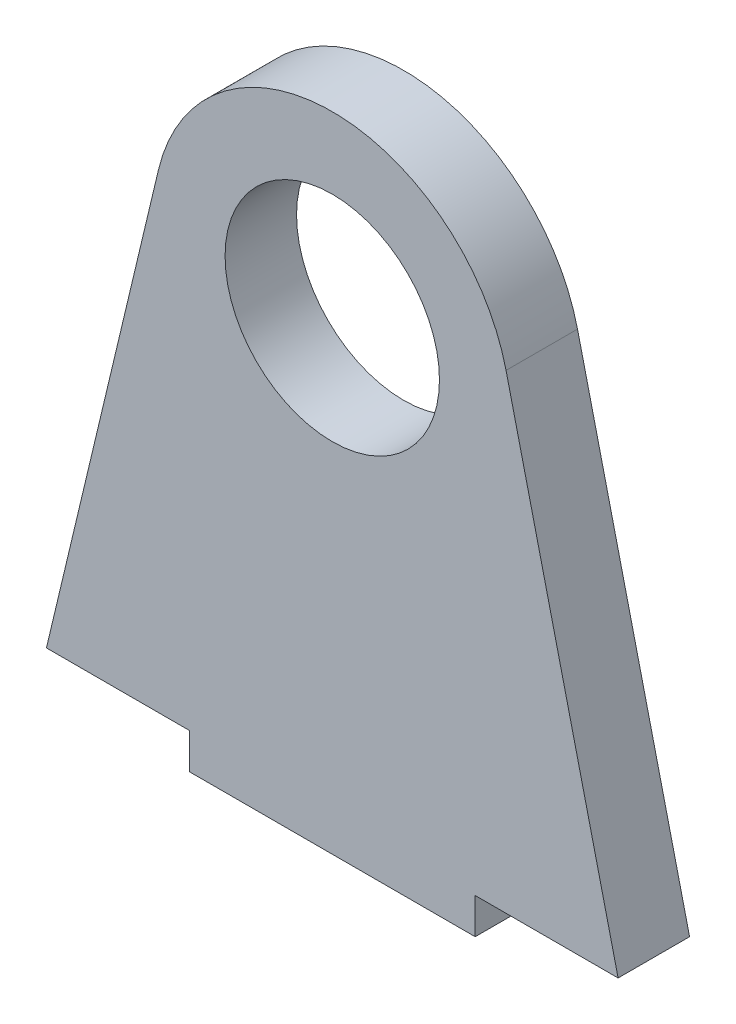
ISO-10303-21;
HEADER;
FILE_DESCRIPTION(('STEP AP214'),'2;1');
FILE_NAME('part.step','',(''),(''),'','','');
FILE_SCHEMA(('AUTOMOTIVE_DESIGN { 1 0 10303 214 1 1 1 1 }'));
ENDSEC;
DATA;
#1=APPLICATION_CONTEXT('core data for automotive mechanical design processes');
#2=APPLICATION_PROTOCOL_DEFINITION('international standard','automotive_design',2000,#1);
#3=PRODUCT_CONTEXT('',#1,'mechanical');
#4=PRODUCT('Part','Part','',(#3));
#5=PRODUCT_RELATED_PRODUCT_CATEGORY('part','',(#4));
#6=PRODUCT_DEFINITION_FORMATION('','',#4);
#7=PRODUCT_DEFINITION_CONTEXT('part definition',#1,'design');
#8=PRODUCT_DEFINITION('design','',#6,#7);
#9=PRODUCT_DEFINITION_SHAPE('','',#8);
#10=(LENGTH_UNIT() NAMED_UNIT(*) SI_UNIT(.MILLI.,.METRE.));
#11=(NAMED_UNIT(*) PLANE_ANGLE_UNIT() SI_UNIT($,.RADIAN.));
#12=(NAMED_UNIT(*) SI_UNIT($,.STERADIAN.) SOLID_ANGLE_UNIT());
#13=UNCERTAINTY_MEASURE_WITH_UNIT(LENGTH_MEASURE(1.E-05),#10,'distance_accuracy_value','');
#14=(GEOMETRIC_REPRESENTATION_CONTEXT(3) GLOBAL_UNCERTAINTY_ASSIGNED_CONTEXT((#13)) GLOBAL_UNIT_ASSIGNED_CONTEXT((#10,
#11,#12)) REPRESENTATION_CONTEXT('',''));
#15=CARTESIAN_POINT('',(0.,0.,0.));
#16=DIRECTION('',(0.,0.,1.));
#17=DIRECTION('',(1.,0.,0.));
#18=AXIS2_PLACEMENT_3D('',#15,#16,#17);
#19=CARTESIAN_POINT('',(0.,16.25,5.));
#20=DIRECTION('',(0.,0.,-1.));
#21=DIRECTION('',(-1.,0.,0.));
#22=AXIS2_PLACEMENT_3D('',#19,#20,#21);
#23=PLANE('',#22);
#24=DIRECTION('',(0.,-1.,0.));
#25=VECTOR('',#24,1.);
#26=CARTESIAN_POINT('',(-10.,-13.75,5.));
#27=LINE('',#26,#25);
#28=CARTESIAN_POINT('',(-10.,-13.75,5.));
#29=VERTEX_POINT('',#28);
#30=CARTESIAN_POINT('',(-10.,-16.25,5.));
#31=VERTEX_POINT('',#30);
#32=EDGE_CURVE('E166',#29,#31,#27,.T.);
#33=ORIENTED_EDGE('',*,*,#32,.T.);
#34=DIRECTION('',(1.,0.,0.));
#35=VECTOR('',#34,1.);
#36=CARTESIAN_POINT('',(10.,-16.25,5.));
#37=LINE('',#36,#35);
#38=CARTESIAN_POINT('',(10.,-16.25,5.));
#39=VERTEX_POINT('',#38);
#40=EDGE_CURVE('E102',#31,#39,#37,.T.);
#41=ORIENTED_EDGE('',*,*,#40,.T.);
#42=DIRECTION('',(0.,1.,0.));
#43=VECTOR('',#42,1.);
#44=CARTESIAN_POINT('',(10.,-13.75,5.));
#45=LINE('',#44,#43);
#46=CARTESIAN_POINT('',(10.,-13.75,5.));
#47=VERTEX_POINT('',#46);
#48=EDGE_CURVE('E187',#39,#47,#45,.T.);
#49=ORIENTED_EDGE('',*,*,#48,.T.);
#50=DIRECTION('',(1.,0.,0.));
#51=VECTOR('',#50,1.);
#52=CARTESIAN_POINT('',(20.,-13.75,5.));
#53=LINE('',#52,#51);
#54=CARTESIAN_POINT('',(20.,-13.75,5.));
#55=VERTEX_POINT('',#54);
#56=EDGE_CURVE('E201',#47,#55,#53,.T.);
#57=ORIENTED_EDGE('',*,*,#56,.T.);
#58=DIRECTION('',(-0.231836509941103,0.972754764911655,0.));
#59=VECTOR('',#58,1.);
#60=CARTESIAN_POINT('',(12.1594345613957,19.1479563742638,5.));
#61=LINE('',#60,#59);
#62=CARTESIAN_POINT('',(12.1594345613957,19.1479563742638,5.));
#63=VERTEX_POINT('',#62);
#64=EDGE_CURVE('E121',#55,#63,#61,.T.);
#65=ORIENTED_EDGE('',*,*,#64,.T.);
#66=CARTESIAN_POINT('',(0.,16.25,5.));
#67=DIRECTION('',(0.,0.,1.));
#68=DIRECTION('',(-1.,0.,0.));
#69=AXIS2_PLACEMENT_3D('',#66,#67,#68);
#70=CIRCLE('',#69,12.5);
#71=CARTESIAN_POINT('',(-12.1594345613957,19.1479563742638,5.));
#72=VERTEX_POINT('',#71);
#73=EDGE_CURVE('E115',#63,#72,#70,.T.);
#74=ORIENTED_EDGE('',*,*,#73,.T.);
#75=DIRECTION('',(-0.231836509941103,-0.972754764911655,0.));
#76=VECTOR('',#75,1.);
#77=CARTESIAN_POINT('',(-12.1594345613957,19.1479563742638,5.));
#78=LINE('',#77,#76);
#79=CARTESIAN_POINT('',(-20.,-13.75,5.));
#80=VERTEX_POINT('',#79);
#81=EDGE_CURVE('E119',#72,#80,#78,.T.);
#82=ORIENTED_EDGE('',*,*,#81,.T.);
#83=DIRECTION('',(1.,0.,0.));
#84=VECTOR('',#83,1.);
#85=CARTESIAN_POINT('',(-20.,-13.75,5.));
#86=LINE('',#85,#84);
#87=EDGE_CURVE('E59',#80,#29,#86,.T.);
#88=ORIENTED_EDGE('',*,*,#87,.T.);
#89=EDGE_LOOP('',(#33,#41,#49,#57,#65,#74,#82,#88));
#90=FACE_BOUND('',#89,.T.);
#91=CARTESIAN_POINT('',(0.,16.25,5.));
#92=DIRECTION('',(0.,0.,1.));
#93=DIRECTION('',(1.,0.,0.));
#94=AXIS2_PLACEMENT_3D('',#91,#92,#93);
#95=CIRCLE('',#94,7.5);
#96=CARTESIAN_POINT('',(7.5,16.25,5.));
#97=VERTEX_POINT('',#96);
#98=EDGE_CURVE('E148',#97,#97,#95,.T.);
#99=ORIENTED_EDGE('',*,*,#98,.F.);
#100=EDGE_LOOP('',(#99));
#101=FACE_BOUND('',#100,.T.);
#102=ADVANCED_FACE('F41',(#90,#101),#23,.F.);
#103=CARTESIAN_POINT('',(0.,16.25,0.));
#104=DIRECTION('',(0.,0.,-1.));
#105=DIRECTION('',(-1.,0.,0.));
#106=AXIS2_PLACEMENT_3D('',#103,#104,#105);
#107=PLANE('',#106);
#108=DIRECTION('',(0.,-1.,0.));
#109=VECTOR('',#108,1.);
#110=CARTESIAN_POINT('',(-10.,-13.75,0.));
#111=LINE('',#110,#109);
#112=CARTESIAN_POINT('',(-10.,-13.75,0.));
#113=VERTEX_POINT('',#112);
#114=CARTESIAN_POINT('',(-10.,-16.25,0.));
#115=VERTEX_POINT('',#114);
#116=EDGE_CURVE('E143',#113,#115,#111,.T.);
#117=ORIENTED_EDGE('',*,*,#116,.F.);
#118=DIRECTION('',(1.,0.,0.));
#119=VECTOR('',#118,1.);
#120=CARTESIAN_POINT('',(-20.,-13.75,0.));
#121=LINE('',#120,#119);
#122=CARTESIAN_POINT('',(-20.,-13.75,0.));
#123=VERTEX_POINT('',#122);
#124=EDGE_CURVE('E94',#123,#113,#121,.T.);
#125=ORIENTED_EDGE('',*,*,#124,.F.);
#126=DIRECTION('',(-0.231836509941103,-0.972754764911655,0.));
#127=VECTOR('',#126,1.);
#128=CARTESIAN_POINT('',(-12.1594345613957,19.1479563742638,0.));
#129=LINE('',#128,#127);
#130=CARTESIAN_POINT('',(-12.1594345613957,19.1479563742638,0.));
#131=VERTEX_POINT('',#130);
#132=EDGE_CURVE('E88',#131,#123,#129,.T.);
#133=ORIENTED_EDGE('',*,*,#132,.F.);
#134=CARTESIAN_POINT('',(0.,16.25,0.));
#135=DIRECTION('',(0.,0.,1.));
#136=DIRECTION('',(-1.,0.,0.));
#137=AXIS2_PLACEMENT_3D('',#134,#135,#136);
#138=CIRCLE('',#137,12.5);
#139=CARTESIAN_POINT('',(12.1594345613957,19.1479563742638,0.));
#140=VERTEX_POINT('',#139);
#141=EDGE_CURVE('E130',#140,#131,#138,.T.);
#142=ORIENTED_EDGE('',*,*,#141,.F.);
#143=DIRECTION('',(-0.231836509941103,0.972754764911655,0.));
#144=VECTOR('',#143,1.);
#145=CARTESIAN_POINT('',(12.1594345613957,19.1479563742638,0.));
#146=LINE('',#145,#144);
#147=CARTESIAN_POINT('',(20.,-13.75,0.));
#148=VERTEX_POINT('',#147);
#149=EDGE_CURVE('E157',#148,#140,#146,.T.);
#150=ORIENTED_EDGE('',*,*,#149,.F.);
#151=DIRECTION('',(1.,0.,0.));
#152=VECTOR('',#151,1.);
#153=CARTESIAN_POINT('',(20.,-13.75,0.));
#154=LINE('',#153,#152);
#155=CARTESIAN_POINT('',(10.,-13.75,0.));
#156=VERTEX_POINT('',#155);
#157=EDGE_CURVE('E154',#156,#148,#154,.T.);
#158=ORIENTED_EDGE('',*,*,#157,.F.);
#159=DIRECTION('',(0.,1.,0.));
#160=VECTOR('',#159,1.);
#161=CARTESIAN_POINT('',(10.,-13.75,0.));
#162=LINE('',#161,#160);
#163=CARTESIAN_POINT('',(10.,-16.25,0.));
#164=VERTEX_POINT('',#163);
#165=EDGE_CURVE('E151',#164,#156,#162,.T.);
#166=ORIENTED_EDGE('',*,*,#165,.F.);
#167=DIRECTION('',(1.,0.,0.));
#168=VECTOR('',#167,1.);
#169=CARTESIAN_POINT('',(10.,-16.25,0.));
#170=LINE('',#169,#168);
#171=EDGE_CURVE('E147',#115,#164,#170,.T.);
#172=ORIENTED_EDGE('',*,*,#171,.F.);
#173=EDGE_LOOP('',(#117,#125,#133,#142,#150,#158,#166,#172));
#174=FACE_BOUND('',#173,.T.);
#175=CARTESIAN_POINT('',(0.,16.25,0.));
#176=DIRECTION('',(0.,0.,1.));
#177=DIRECTION('',(1.,0.,0.));
#178=AXIS2_PLACEMENT_3D('',#175,#176,#177);
#179=CIRCLE('',#178,7.5);
#180=CARTESIAN_POINT('',(7.5,16.25,0.));
#181=VERTEX_POINT('',#180);
#182=EDGE_CURVE('E211',#181,#181,#179,.T.);
#183=ORIENTED_EDGE('',*,*,#182,.T.);
#184=EDGE_LOOP('',(#183));
#185=FACE_BOUND('',#184,.T.);
#186=ADVANCED_FACE('F191',(#174,#185),#107,.T.);
#187=CARTESIAN_POINT('',(-10.,-13.75,5.));
#188=DIRECTION('',(1.,0.,0.));
#189=DIRECTION('',(0.,1.,0.));
#190=AXIS2_PLACEMENT_3D('',#187,#188,#189);
#191=PLANE('',#190);
#192=ORIENTED_EDGE('',*,*,#116,.T.);
#193=DIRECTION('',(0.,0.,-1.));
#194=VECTOR('',#193,1.);
#195=CARTESIAN_POINT('',(-10.,-16.25,5.));
#196=LINE('',#195,#194);
#197=EDGE_CURVE('E11',#31,#115,#196,.T.);
#198=ORIENTED_EDGE('',*,*,#197,.F.);
#199=ORIENTED_EDGE('',*,*,#32,.F.);
#200=DIRECTION('',(0.,0.,-1.));
#201=VECTOR('',#200,1.);
#202=CARTESIAN_POINT('',(-10.,-13.75,5.));
#203=LINE('',#202,#201);
#204=EDGE_CURVE('E139',#29,#113,#203,.T.);
#205=ORIENTED_EDGE('',*,*,#204,.T.);
#206=EDGE_LOOP('',(#192,#198,#199,#205));
#207=FACE_BOUND('',#206,.T.);
#208=ADVANCED_FACE('F43',(#207),#191,.F.);
#209=CARTESIAN_POINT('',(10.,-16.25,5.));
#210=DIRECTION('',(0.,1.,0.));
#211=DIRECTION('',(-1.,0.,0.));
#212=AXIS2_PLACEMENT_3D('',#209,#210,#211);
#213=PLANE('',#212);
#214=ORIENTED_EDGE('',*,*,#171,.T.);
#215=DIRECTION('',(0.,0.,-1.));
#216=VECTOR('',#215,1.);
#217=CARTESIAN_POINT('',(10.,-16.25,5.));
#218=LINE('',#217,#216);
#219=EDGE_CURVE('E51',#39,#164,#218,.T.);
#220=ORIENTED_EDGE('',*,*,#219,.F.);
#221=ORIENTED_EDGE('',*,*,#40,.F.);
#222=ORIENTED_EDGE('',*,*,#197,.T.);
#223=EDGE_LOOP('',(#214,#220,#221,#222));
#224=FACE_BOUND('',#223,.T.);
#225=ADVANCED_FACE('F241',(#224),#213,.F.);
#226=CARTESIAN_POINT('',(10.,-13.75,5.));
#227=DIRECTION('',(-1.,0.,0.));
#228=DIRECTION('',(0.,-1.,0.));
#229=AXIS2_PLACEMENT_3D('',#226,#227,#228);
#230=PLANE('',#229);
#231=ORIENTED_EDGE('',*,*,#165,.T.);
#232=DIRECTION('',(0.,0.,-1.));
#233=VECTOR('',#232,1.);
#234=CARTESIAN_POINT('',(10.,-13.75,5.));
#235=LINE('',#234,#233);
#236=EDGE_CURVE('E177',#47,#156,#235,.T.);
#237=ORIENTED_EDGE('',*,*,#236,.F.);
#238=ORIENTED_EDGE('',*,*,#48,.F.);
#239=ORIENTED_EDGE('',*,*,#219,.T.);
#240=EDGE_LOOP('',(#231,#237,#238,#239));
#241=FACE_BOUND('',#240,.T.);
#242=ADVANCED_FACE('F185',(#241),#230,.F.);
#243=CARTESIAN_POINT('',(20.,-13.75,5.));
#244=DIRECTION('',(0.,1.,0.));
#245=DIRECTION('',(-1.,0.,0.));
#246=AXIS2_PLACEMENT_3D('',#243,#244,#245);
#247=PLANE('',#246);
#248=ORIENTED_EDGE('',*,*,#157,.T.);
#249=DIRECTION('',(0.,0.,-1.));
#250=VECTOR('',#249,1.);
#251=CARTESIAN_POINT('',(20.,-13.75,5.));
#252=LINE('',#251,#250);
#253=EDGE_CURVE('E173',#55,#148,#252,.T.);
#254=ORIENTED_EDGE('',*,*,#253,.F.);
#255=ORIENTED_EDGE('',*,*,#56,.F.);
#256=ORIENTED_EDGE('',*,*,#236,.T.);
#257=EDGE_LOOP('',(#248,#254,#255,#256));
#258=FACE_BOUND('',#257,.T.);
#259=ADVANCED_FACE('F196',(#258),#247,.F.);
#260=CARTESIAN_POINT('',(12.1594345613957,19.1479563742638,5.));
#261=DIRECTION('',(-0.972754764911655,-0.231836509941103,0.));
#262=DIRECTION('',(0.231836509941103,-0.972754764911655,0.));
#263=AXIS2_PLACEMENT_3D('',#260,#261,#262);
#264=PLANE('',#263);
#265=ORIENTED_EDGE('',*,*,#149,.T.);
#266=DIRECTION('',(0.,0.,-1.));
#267=VECTOR('',#266,1.);
#268=CARTESIAN_POINT('',(12.1594345613957,19.1479563742638,5.));
#269=LINE('',#268,#267);
#270=EDGE_CURVE('E132',#63,#140,#269,.T.);
#271=ORIENTED_EDGE('',*,*,#270,.F.);
#272=ORIENTED_EDGE('',*,*,#64,.F.);
#273=ORIENTED_EDGE('',*,*,#253,.T.);
#274=EDGE_LOOP('',(#265,#271,#272,#273));
#275=FACE_BOUND('',#274,.T.);
#276=ADVANCED_FACE('F199',(#275),#264,.F.);
#277=CARTESIAN_POINT('',(0.,16.25,5.));
#278=DIRECTION('',(0.,0.,-1.));
#279=DIRECTION('',(-1.,0.,0.));
#280=AXIS2_PLACEMENT_3D('',#277,#278,#279);
#281=CYLINDRICAL_SURFACE('',#280,12.5);
#282=ORIENTED_EDGE('',*,*,#141,.T.);
#283=DIRECTION('',(0.,0.,-1.));
#284=VECTOR('',#283,1.);
#285=CARTESIAN_POINT('',(-12.1594345613957,19.1479563742638,5.));
#286=LINE('',#285,#284);
#287=EDGE_CURVE('E127',#72,#131,#286,.T.);
#288=ORIENTED_EDGE('',*,*,#287,.F.);
#289=ORIENTED_EDGE('',*,*,#73,.F.);
#290=ORIENTED_EDGE('',*,*,#270,.T.);
#291=EDGE_LOOP('',(#282,#288,#289,#290));
#292=FACE_BOUND('',#291,.T.);
#293=ADVANCED_FACE('F128',(#292),#281,.T.);
#294=CARTESIAN_POINT('',(-12.1594345613957,19.1479563742638,5.));
#295=DIRECTION('',(0.972754764911655,-0.231836509941103,0.));
#296=DIRECTION('',(0.231836509941103,0.972754764911655,0.));
#297=AXIS2_PLACEMENT_3D('',#294,#295,#296);
#298=PLANE('',#297);
#299=ORIENTED_EDGE('',*,*,#132,.T.);
#300=DIRECTION('',(0.,0.,-1.));
#301=VECTOR('',#300,1.);
#302=CARTESIAN_POINT('',(-20.,-13.75,5.));
#303=LINE('',#302,#301);
#304=EDGE_CURVE('E133',#80,#123,#303,.T.);
#305=ORIENTED_EDGE('',*,*,#304,.F.);
#306=ORIENTED_EDGE('',*,*,#81,.F.);
#307=ORIENTED_EDGE('',*,*,#287,.T.);
#308=EDGE_LOOP('',(#299,#305,#306,#307));
#309=FACE_BOUND('',#308,.T.);
#310=ADVANCED_FACE('F135',(#309),#298,.F.);
#311=CARTESIAN_POINT('',(-20.,-13.75,5.));
#312=DIRECTION('',(0.,1.,0.));
#313=DIRECTION('',(-1.,0.,0.));
#314=AXIS2_PLACEMENT_3D('',#311,#312,#313);
#315=PLANE('',#314);
#316=ORIENTED_EDGE('',*,*,#124,.T.);
#317=ORIENTED_EDGE('',*,*,#204,.F.);
#318=ORIENTED_EDGE('',*,*,#87,.F.);
#319=ORIENTED_EDGE('',*,*,#304,.T.);
#320=EDGE_LOOP('',(#316,#317,#318,#319));
#321=FACE_BOUND('',#320,.T.);
#322=ADVANCED_FACE('F229',(#321),#315,.F.);
#323=CARTESIAN_POINT('',(0.,16.25,5.));
#324=DIRECTION('',(0.,0.,-1.));
#325=DIRECTION('',(-1.,0.,0.));
#326=AXIS2_PLACEMENT_3D('',#323,#324,#325);
#327=CYLINDRICAL_SURFACE('',#326,7.5);
#328=ORIENTED_EDGE('',*,*,#98,.T.);
#329=EDGE_LOOP('',(#328));
#330=FACE_BOUND('',#329,.T.);
#331=ORIENTED_EDGE('',*,*,#182,.F.);
#332=EDGE_LOOP('',(#331));
#333=FACE_BOUND('',#332,.T.);
#334=ADVANCED_FACE('F219',(#330,#333),#327,.F.);
#335=CLOSED_SHELL('',(#102,#186,#208,#225,#242,#259,#276,#293,#310,#322,#334));
#336=MANIFOLD_SOLID_BREP('B2',#335);
#337=ADVANCED_BREP_SHAPE_REPRESENTATION('',(#18,#336),#14);
#338=SHAPE_DEFINITION_REPRESENTATION(#9,#337);
ENDSEC;
END-ISO-10303-21;
